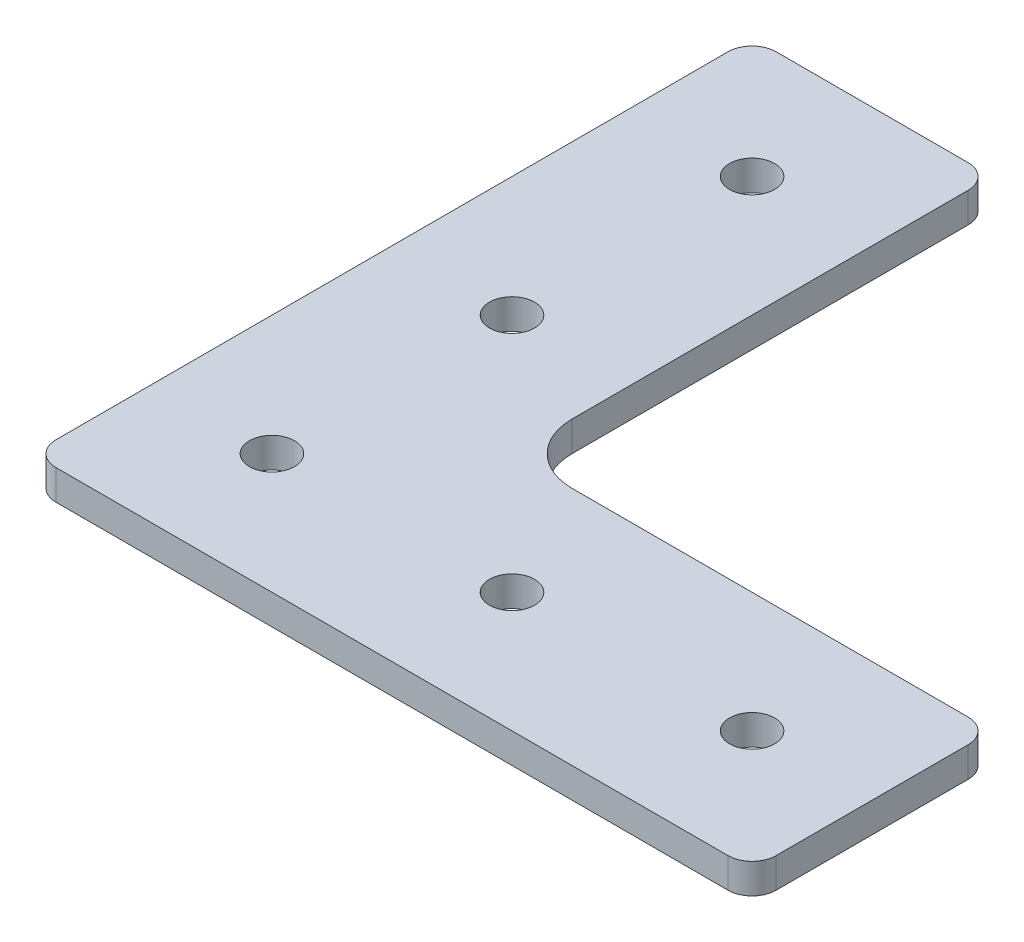
ISO-10303-21;
HEADER;
FILE_DESCRIPTION(('STEP AP214'),'2;1');
FILE_NAME('part.step','',(''),(''),'','','');
FILE_SCHEMA(('AUTOMOTIVE_DESIGN { 1 0 10303 214 1 1 1 1 }'));
ENDSEC;
DATA;
#1=APPLICATION_CONTEXT('core data for automotive mechanical design processes');
#2=APPLICATION_PROTOCOL_DEFINITION('international standard','automotive_design',2000,#1);
#3=PRODUCT_CONTEXT('',#1,'mechanical');
#4=PRODUCT('Part','Part','',(#3));
#5=PRODUCT_RELATED_PRODUCT_CATEGORY('part','',(#4));
#6=PRODUCT_DEFINITION_FORMATION('','',#4);
#7=PRODUCT_DEFINITION_CONTEXT('part definition',#1,'design');
#8=PRODUCT_DEFINITION('design','',#6,#7);
#9=PRODUCT_DEFINITION_SHAPE('','',#8);
#10=(LENGTH_UNIT() NAMED_UNIT(*) SI_UNIT(.MILLI.,.METRE.));
#11=(NAMED_UNIT(*) PLANE_ANGLE_UNIT() SI_UNIT($,.RADIAN.));
#12=(NAMED_UNIT(*) SI_UNIT($,.STERADIAN.) SOLID_ANGLE_UNIT());
#13=UNCERTAINTY_MEASURE_WITH_UNIT(LENGTH_MEASURE(1.E-05),#10,'distance_accuracy_value','');
#14=(GEOMETRIC_REPRESENTATION_CONTEXT(3) GLOBAL_UNCERTAINTY_ASSIGNED_CONTEXT((#13)) GLOBAL_UNIT_ASSIGNED_CONTEXT((#10,
#11,#12)) REPRESENTATION_CONTEXT('',''));
#15=CARTESIAN_POINT('',(0.,0.,0.));
#16=DIRECTION('',(0.,0.,1.));
#17=DIRECTION('',(1.,0.,0.));
#18=AXIS2_PLACEMENT_3D('',#15,#16,#17);
#19=CARTESIAN_POINT('',(60.96,3.175,35.56));
#20=DIRECTION('',(0.,1.,0.));
#21=DIRECTION('',(0.,0.,1.));
#22=AXIS2_PLACEMENT_3D('',#19,#20,#21);
#23=PLANE('',#22);
#24=CARTESIAN_POINT('',(25.4,3.175,25.4));
#25=DIRECTION('',(0.,1.,0.));
#26=DIRECTION('',(0.,0.,1.));
#27=AXIS2_PLACEMENT_3D('',#24,#25,#26);
#28=CIRCLE('',#27,2.38125);
#29=CARTESIAN_POINT('',(25.4,3.175,27.78125));
#30=VERTEX_POINT('',#29);
#31=EDGE_CURVE('E265',#30,#30,#28,.T.);
#32=ORIENTED_EDGE('',*,*,#31,.F.);
#33=EDGE_LOOP('',(#32));
#34=FACE_BOUND('',#33,.T.);
#35=CARTESIAN_POINT('',(0.,3.175,0.));
#36=DIRECTION('',(0.,1.,0.));
#37=DIRECTION('',(0.,0.,1.));
#38=AXIS2_PLACEMENT_3D('',#35,#36,#37);
#39=CIRCLE('',#38,2.38125);
#40=CARTESIAN_POINT('',(0.,3.175,2.38125));
#41=VERTEX_POINT('',#40);
#42=EDGE_CURVE('E253',#41,#41,#39,.T.);
#43=ORIENTED_EDGE('',*,*,#42,.F.);
#44=EDGE_LOOP('',(#43));
#45=FACE_BOUND('',#44,.T.);
#46=DIRECTION('',(1.,0.,0.));
#47=VECTOR('',#46,1.);
#48=CARTESIAN_POINT('',(6.34999999999999,3.175,38.1));
#49=LINE('',#48,#47);
#50=CARTESIAN_POINT('',(-10.16,3.175,38.1));
#51=VERTEX_POINT('',#50);
#52=CARTESIAN_POINT('',(60.96,3.175,38.1));
#53=VERTEX_POINT('',#52);
#54=EDGE_CURVE('E50',#51,#53,#49,.T.);
#55=ORIENTED_EDGE('',*,*,#54,.T.);
#56=CARTESIAN_POINT('',(60.96,3.175,35.56));
#57=DIRECTION('',(0.,1.,0.));
#58=DIRECTION('',(0.,0.,1.));
#59=AXIS2_PLACEMENT_3D('',#56,#57,#58);
#60=CIRCLE('',#59,2.54);
#61=CARTESIAN_POINT('',(63.5,3.175,35.56));
#62=VERTEX_POINT('',#61);
#63=EDGE_CURVE('E106',#53,#62,#60,.T.);
#64=ORIENTED_EDGE('',*,*,#63,.T.);
#65=DIRECTION('',(0.,0.,-1.));
#66=VECTOR('',#65,1.);
#67=CARTESIAN_POINT('',(63.5,3.175,35.56));
#68=LINE('',#67,#66);
#69=CARTESIAN_POINT('',(63.5,3.175,15.24));
#70=VERTEX_POINT('',#69);
#71=EDGE_CURVE('E206',#62,#70,#68,.T.);
#72=ORIENTED_EDGE('',*,*,#71,.T.);
#73=CARTESIAN_POINT('',(60.96,3.175,15.24));
#74=DIRECTION('',(0.,1.,0.));
#75=DIRECTION('',(0.,0.,1.));
#76=AXIS2_PLACEMENT_3D('',#73,#74,#75);
#77=CIRCLE('',#76,2.54);
#78=CARTESIAN_POINT('',(60.96,3.175,12.7));
#79=VERTEX_POINT('',#78);
#80=EDGE_CURVE('E226',#70,#79,#77,.T.);
#81=ORIENTED_EDGE('',*,*,#80,.T.);
#82=DIRECTION('',(-1.,0.,0.));
#83=VECTOR('',#82,1.);
#84=CARTESIAN_POINT('',(19.05,3.175,12.7));
#85=LINE('',#84,#83);
#86=CARTESIAN_POINT('',(19.05,3.175,12.7));
#87=VERTEX_POINT('',#86);
#88=EDGE_CURVE('E223',#79,#87,#85,.T.);
#89=ORIENTED_EDGE('',*,*,#88,.T.);
#90=CARTESIAN_POINT('',(19.05,3.175,6.35));
#91=DIRECTION('',(0.,-1.,0.));
#92=DIRECTION('',(0.,0.,-1.));
#93=AXIS2_PLACEMENT_3D('',#90,#91,#92);
#94=CIRCLE('',#93,6.35);
#95=CARTESIAN_POINT('',(12.7,3.175,6.35));
#96=VERTEX_POINT('',#95);
#97=EDGE_CURVE('E225',#87,#96,#94,.T.);
#98=ORIENTED_EDGE('',*,*,#97,.T.);
#99=DIRECTION('',(0.,0.,-1.));
#100=VECTOR('',#99,1.);
#101=CARTESIAN_POINT('',(12.7,3.175,6.35));
#102=LINE('',#101,#100);
#103=CARTESIAN_POINT('',(12.7,3.175,-35.56));
#104=VERTEX_POINT('',#103);
#105=EDGE_CURVE('E228',#96,#104,#102,.T.);
#106=ORIENTED_EDGE('',*,*,#105,.T.);
#107=CARTESIAN_POINT('',(10.16,3.175,-35.56));
#108=DIRECTION('',(0.,1.,0.));
#109=DIRECTION('',(0.,0.,1.));
#110=AXIS2_PLACEMENT_3D('',#107,#108,#109);
#111=CIRCLE('',#110,2.54);
#112=CARTESIAN_POINT('',(10.16,3.175,-38.1));
#113=VERTEX_POINT('',#112);
#114=EDGE_CURVE('E234',#104,#113,#111,.T.);
#115=ORIENTED_EDGE('',*,*,#114,.T.);
#116=DIRECTION('',(-1.,0.,0.));
#117=VECTOR('',#116,1.);
#118=CARTESIAN_POINT('',(-10.16,3.175,-38.1));
#119=LINE('',#118,#117);
#120=CARTESIAN_POINT('',(-10.16,3.175,-38.1));
#121=VERTEX_POINT('',#120);
#122=EDGE_CURVE('E138',#113,#121,#119,.T.);
#123=ORIENTED_EDGE('',*,*,#122,.T.);
#124=CARTESIAN_POINT('',(-10.16,3.175,-35.56));
#125=DIRECTION('',(0.,1.,0.));
#126=DIRECTION('',(0.,0.,-1.));
#127=AXIS2_PLACEMENT_3D('',#124,#125,#126);
#128=CIRCLE('',#127,2.54);
#129=CARTESIAN_POINT('',(-12.7,3.175,-35.56));
#130=VERTEX_POINT('',#129);
#131=EDGE_CURVE('E132',#121,#130,#128,.T.);
#132=ORIENTED_EDGE('',*,*,#131,.T.);
#133=DIRECTION('',(0.,0.,1.));
#134=VECTOR('',#133,1.);
#135=CARTESIAN_POINT('',(-12.7,3.175,35.56));
#136=LINE('',#135,#134);
#137=CARTESIAN_POINT('',(-12.7,3.175,35.56));
#138=VERTEX_POINT('',#137);
#139=EDGE_CURVE('E136',#130,#138,#136,.T.);
#140=ORIENTED_EDGE('',*,*,#139,.T.);
#141=CARTESIAN_POINT('',(-10.16,3.175,35.56));
#142=DIRECTION('',(0.,1.,0.));
#143=DIRECTION('',(0.,0.,1.));
#144=AXIS2_PLACEMENT_3D('',#141,#142,#143);
#145=CIRCLE('',#144,2.54);
#146=EDGE_CURVE('E152',#138,#51,#145,.T.);
#147=ORIENTED_EDGE('',*,*,#146,.T.);
#148=EDGE_LOOP('',(#55,#64,#72,#81,#89,#98,#106,#115,#123,#132,#140,#147));
#149=FACE_BOUND('',#148,.T.);
#150=CARTESIAN_POINT('',(0.,3.175,25.4));
#151=DIRECTION('',(0.,1.,0.));
#152=DIRECTION('',(0.,0.,1.));
#153=AXIS2_PLACEMENT_3D('',#150,#151,#152);
#154=CIRCLE('',#153,2.38125);
#155=CARTESIAN_POINT('',(0.,3.175,27.78125));
#156=VERTEX_POINT('',#155);
#157=EDGE_CURVE('E161',#156,#156,#154,.T.);
#158=ORIENTED_EDGE('',*,*,#157,.F.);
#159=EDGE_LOOP('',(#158));
#160=FACE_BOUND('',#159,.T.);
#161=CARTESIAN_POINT('',(0.,3.175,-25.4));
#162=DIRECTION('',(0.,1.,0.));
#163=DIRECTION('',(0.,0.,1.));
#164=AXIS2_PLACEMENT_3D('',#161,#162,#163);
#165=CIRCLE('',#164,2.38125);
#166=CARTESIAN_POINT('',(0.,3.175,-23.01875));
#167=VERTEX_POINT('',#166);
#168=EDGE_CURVE('E259',#167,#167,#165,.T.);
#169=ORIENTED_EDGE('',*,*,#168,.F.);
#170=EDGE_LOOP('',(#169));
#171=FACE_BOUND('',#170,.T.);
#172=CARTESIAN_POINT('',(50.8,3.175,25.4));
#173=DIRECTION('',(0.,1.,0.));
#174=DIRECTION('',(0.,0.,1.));
#175=AXIS2_PLACEMENT_3D('',#172,#173,#174);
#176=CIRCLE('',#175,2.38125);
#177=CARTESIAN_POINT('',(50.8,3.175,27.78125));
#178=VERTEX_POINT('',#177);
#179=EDGE_CURVE('E271',#178,#178,#176,.T.);
#180=ORIENTED_EDGE('',*,*,#179,.F.);
#181=EDGE_LOOP('',(#180));
#182=FACE_BOUND('',#181,.T.);
#183=ADVANCED_FACE('F33',(#34,#45,#149,#160,#171,#182),#23,.T.);
#184=CARTESIAN_POINT('',(60.96,0.,35.56));
#185=DIRECTION('',(0.,1.,0.));
#186=DIRECTION('',(0.,0.,1.));
#187=AXIS2_PLACEMENT_3D('',#184,#185,#186);
#188=PLANE('',#187);
#189=CARTESIAN_POINT('',(60.96,0.,35.56));
#190=DIRECTION('',(0.,1.,0.));
#191=DIRECTION('',(0.,0.,1.));
#192=AXIS2_PLACEMENT_3D('',#189,#190,#191);
#193=CIRCLE('',#192,2.54);
#194=CARTESIAN_POINT('',(60.96,0.,38.1));
#195=VERTEX_POINT('',#194);
#196=CARTESIAN_POINT('',(63.5,0.,35.56));
#197=VERTEX_POINT('',#196);
#198=EDGE_CURVE('E158',#195,#197,#193,.T.);
#199=ORIENTED_EDGE('',*,*,#198,.F.);
#200=DIRECTION('',(1.,0.,0.));
#201=VECTOR('',#200,1.);
#202=CARTESIAN_POINT('',(-10.16,0.,38.1));
#203=LINE('',#202,#201);
#204=CARTESIAN_POINT('',(-10.16,0.,38.1));
#205=VERTEX_POINT('',#204);
#206=EDGE_CURVE('E178',#205,#195,#203,.T.);
#207=ORIENTED_EDGE('',*,*,#206,.F.);
#208=CARTESIAN_POINT('',(-10.16,0.,35.56));
#209=DIRECTION('',(0.,1.,0.));
#210=DIRECTION('',(0.,0.,1.));
#211=AXIS2_PLACEMENT_3D('',#208,#209,#210);
#212=CIRCLE('',#211,2.54);
#213=CARTESIAN_POINT('',(-12.7,0.,35.56));
#214=VERTEX_POINT('',#213);
#215=EDGE_CURVE('E99',#214,#205,#212,.T.);
#216=ORIENTED_EDGE('',*,*,#215,.F.);
#217=DIRECTION('',(0.,0.,1.));
#218=VECTOR('',#217,1.);
#219=CARTESIAN_POINT('',(-12.7,0.,35.56));
#220=LINE('',#219,#218);
#221=CARTESIAN_POINT('',(-12.7,0.,-35.56));
#222=VERTEX_POINT('',#221);
#223=EDGE_CURVE('E92',#222,#214,#220,.T.);
#224=ORIENTED_EDGE('',*,*,#223,.F.);
#225=CARTESIAN_POINT('',(-10.16,0.,-35.56));
#226=DIRECTION('',(0.,1.,0.));
#227=DIRECTION('',(0.,0.,-1.));
#228=AXIS2_PLACEMENT_3D('',#225,#226,#227);
#229=CIRCLE('',#228,2.54);
#230=CARTESIAN_POINT('',(-10.16,0.,-38.1));
#231=VERTEX_POINT('',#230);
#232=EDGE_CURVE('E146',#231,#222,#229,.T.);
#233=ORIENTED_EDGE('',*,*,#232,.F.);
#234=DIRECTION('',(-1.,0.,0.));
#235=VECTOR('',#234,1.);
#236=CARTESIAN_POINT('',(-10.16,0.,-38.1));
#237=LINE('',#236,#235);
#238=CARTESIAN_POINT('',(10.16,0.,-38.1));
#239=VERTEX_POINT('',#238);
#240=EDGE_CURVE('E173',#239,#231,#237,.T.);
#241=ORIENTED_EDGE('',*,*,#240,.F.);
#242=CARTESIAN_POINT('',(10.16,0.,-35.56));
#243=DIRECTION('',(0.,1.,0.));
#244=DIRECTION('',(0.,0.,1.));
#245=AXIS2_PLACEMENT_3D('',#242,#243,#244);
#246=CIRCLE('',#245,2.54);
#247=CARTESIAN_POINT('',(12.7,0.,-35.56));
#248=VERTEX_POINT('',#247);
#249=EDGE_CURVE('E171',#248,#239,#246,.T.);
#250=ORIENTED_EDGE('',*,*,#249,.F.);
#251=DIRECTION('',(0.,0.,-1.));
#252=VECTOR('',#251,1.);
#253=CARTESIAN_POINT('',(12.7,0.,6.35));
#254=LINE('',#253,#252);
#255=CARTESIAN_POINT('',(12.7,0.,6.35));
#256=VERTEX_POINT('',#255);
#257=EDGE_CURVE('E169',#256,#248,#254,.T.);
#258=ORIENTED_EDGE('',*,*,#257,.F.);
#259=CARTESIAN_POINT('',(19.05,0.,6.35));
#260=DIRECTION('',(0.,-1.,0.));
#261=DIRECTION('',(0.,0.,-1.));
#262=AXIS2_PLACEMENT_3D('',#259,#260,#261);
#263=CIRCLE('',#262,6.35);
#264=CARTESIAN_POINT('',(19.05,0.,12.7));
#265=VERTEX_POINT('',#264);
#266=EDGE_CURVE('E167',#265,#256,#263,.T.);
#267=ORIENTED_EDGE('',*,*,#266,.F.);
#268=DIRECTION('',(-1.,0.,0.));
#269=VECTOR('',#268,1.);
#270=CARTESIAN_POINT('',(19.05,0.,12.7));
#271=LINE('',#270,#269);
#272=CARTESIAN_POINT('',(60.96,0.,12.7));
#273=VERTEX_POINT('',#272);
#274=EDGE_CURVE('E165',#273,#265,#271,.T.);
#275=ORIENTED_EDGE('',*,*,#274,.F.);
#276=CARTESIAN_POINT('',(60.96,0.,15.24));
#277=DIRECTION('',(0.,1.,0.));
#278=DIRECTION('',(0.,0.,1.));
#279=AXIS2_PLACEMENT_3D('',#276,#277,#278);
#280=CIRCLE('',#279,2.54);
#281=CARTESIAN_POINT('',(63.5,0.,15.24));
#282=VERTEX_POINT('',#281);
#283=EDGE_CURVE('E163',#282,#273,#280,.T.);
#284=ORIENTED_EDGE('',*,*,#283,.F.);
#285=DIRECTION('',(0.,0.,-1.));
#286=VECTOR('',#285,1.);
#287=CARTESIAN_POINT('',(63.5,0.,35.56));
#288=LINE('',#287,#286);
#289=EDGE_CURVE('E160',#197,#282,#288,.T.);
#290=ORIENTED_EDGE('',*,*,#289,.F.);
#291=EDGE_LOOP('',(#199,#207,#216,#224,#233,#241,#250,#258,#267,#275,#284,#290));
#292=FACE_BOUND('',#291,.T.);
#293=CARTESIAN_POINT('',(0.,0.,25.4));
#294=DIRECTION('',(0.,1.,0.));
#295=DIRECTION('',(0.,0.,1.));
#296=AXIS2_PLACEMENT_3D('',#293,#294,#295);
#297=CIRCLE('',#296,2.38125);
#298=CARTESIAN_POINT('',(0.,0.,27.78125));
#299=VERTEX_POINT('',#298);
#300=EDGE_CURVE('E250',#299,#299,#297,.T.);
#301=ORIENTED_EDGE('',*,*,#300,.T.);
#302=EDGE_LOOP('',(#301));
#303=FACE_BOUND('',#302,.T.);
#304=CARTESIAN_POINT('',(0.,0.,0.));
#305=DIRECTION('',(0.,1.,0.));
#306=DIRECTION('',(0.,0.,1.));
#307=AXIS2_PLACEMENT_3D('',#304,#305,#306);
#308=CIRCLE('',#307,2.38125);
#309=CARTESIAN_POINT('',(0.,0.,2.38125));
#310=VERTEX_POINT('',#309);
#311=EDGE_CURVE('E256',#310,#310,#308,.T.);
#312=ORIENTED_EDGE('',*,*,#311,.T.);
#313=EDGE_LOOP('',(#312));
#314=FACE_BOUND('',#313,.T.);
#315=CARTESIAN_POINT('',(0.,0.,-25.4));
#316=DIRECTION('',(0.,1.,0.));
#317=DIRECTION('',(0.,0.,1.));
#318=AXIS2_PLACEMENT_3D('',#315,#316,#317);
#319=CIRCLE('',#318,2.38125);
#320=CARTESIAN_POINT('',(0.,0.,-23.01875));
#321=VERTEX_POINT('',#320);
#322=EDGE_CURVE('E262',#321,#321,#319,.T.);
#323=ORIENTED_EDGE('',*,*,#322,.T.);
#324=EDGE_LOOP('',(#323));
#325=FACE_BOUND('',#324,.T.);
#326=CARTESIAN_POINT('',(25.4,0.,25.4));
#327=DIRECTION('',(0.,1.,0.));
#328=DIRECTION('',(0.,0.,1.));
#329=AXIS2_PLACEMENT_3D('',#326,#327,#328);
#330=CIRCLE('',#329,2.38125);
#331=CARTESIAN_POINT('',(25.4,0.,27.78125));
#332=VERTEX_POINT('',#331);
#333=EDGE_CURVE('E268',#332,#332,#330,.T.);
#334=ORIENTED_EDGE('',*,*,#333,.T.);
#335=EDGE_LOOP('',(#334));
#336=FACE_BOUND('',#335,.T.);
#337=CARTESIAN_POINT('',(50.8,0.,25.4));
#338=DIRECTION('',(0.,1.,0.));
#339=DIRECTION('',(0.,0.,1.));
#340=AXIS2_PLACEMENT_3D('',#337,#338,#339);
#341=CIRCLE('',#340,2.38125);
#342=CARTESIAN_POINT('',(50.8,0.,27.78125));
#343=VERTEX_POINT('',#342);
#344=EDGE_CURVE('E274',#343,#343,#341,.T.);
#345=ORIENTED_EDGE('',*,*,#344,.T.);
#346=EDGE_LOOP('',(#345));
#347=FACE_BOUND('',#346,.T.);
#348=ADVANCED_FACE('F210',(#292,#303,#314,#325,#336,#347),#188,.F.);
#349=CARTESIAN_POINT('',(60.96,3.175,35.56));
#350=DIRECTION('',(0.,-1.,0.));
#351=DIRECTION('',(0.,0.,-1.));
#352=AXIS2_PLACEMENT_3D('',#349,#350,#351);
#353=CYLINDRICAL_SURFACE('',#352,2.54);
#354=ORIENTED_EDGE('',*,*,#198,.T.);
#355=DIRECTION('',(0.,-1.,0.));
#356=VECTOR('',#355,1.);
#357=CARTESIAN_POINT('',(63.5,3.175,35.56));
#358=LINE('',#357,#356);
#359=EDGE_CURVE('E42',#62,#197,#358,.T.);
#360=ORIENTED_EDGE('',*,*,#359,.F.);
#361=ORIENTED_EDGE('',*,*,#63,.F.);
#362=DIRECTION('',(0.,-1.,0.));
#363=VECTOR('',#362,1.);
#364=CARTESIAN_POINT('',(60.96,3.175,38.1));
#365=LINE('',#364,#363);
#366=EDGE_CURVE('E11',#53,#195,#365,.T.);
#367=ORIENTED_EDGE('',*,*,#366,.T.);
#368=EDGE_LOOP('',(#354,#360,#361,#367));
#369=FACE_BOUND('',#368,.T.);
#370=ADVANCED_FACE('F35',(#369),#353,.T.);
#371=CARTESIAN_POINT('',(63.5,3.175,35.56));
#372=DIRECTION('',(-1.,0.,0.));
#373=DIRECTION('',(0.,0.,1.));
#374=AXIS2_PLACEMENT_3D('',#371,#372,#373);
#375=PLANE('',#374);
#376=ORIENTED_EDGE('',*,*,#289,.T.);
#377=DIRECTION('',(0.,-1.,0.));
#378=VECTOR('',#377,1.);
#379=CARTESIAN_POINT('',(63.5,3.175,15.24));
#380=LINE('',#379,#378);
#381=EDGE_CURVE('E198',#70,#282,#380,.T.);
#382=ORIENTED_EDGE('',*,*,#381,.F.);
#383=ORIENTED_EDGE('',*,*,#71,.F.);
#384=ORIENTED_EDGE('',*,*,#359,.T.);
#385=EDGE_LOOP('',(#376,#382,#383,#384));
#386=FACE_BOUND('',#385,.T.);
#387=ADVANCED_FACE('F204',(#386),#375,.F.);
#388=CARTESIAN_POINT('',(60.96,3.175,15.24));
#389=DIRECTION('',(0.,-1.,0.));
#390=DIRECTION('',(0.,0.,-1.));
#391=AXIS2_PLACEMENT_3D('',#388,#389,#390);
#392=CYLINDRICAL_SURFACE('',#391,2.54);
#393=ORIENTED_EDGE('',*,*,#283,.T.);
#394=DIRECTION('',(0.,-1.,0.));
#395=VECTOR('',#394,1.);
#396=CARTESIAN_POINT('',(60.96,3.175,12.7));
#397=LINE('',#396,#395);
#398=EDGE_CURVE('E195',#79,#273,#397,.T.);
#399=ORIENTED_EDGE('',*,*,#398,.F.);
#400=ORIENTED_EDGE('',*,*,#80,.F.);
#401=ORIENTED_EDGE('',*,*,#381,.T.);
#402=EDGE_LOOP('',(#393,#399,#400,#401));
#403=FACE_BOUND('',#402,.T.);
#404=ADVANCED_FACE('F217',(#403),#392,.T.);
#405=CARTESIAN_POINT('',(19.05,3.175,12.7));
#406=DIRECTION('',(0.,0.,1.));
#407=DIRECTION('',(1.,0.,0.));
#408=AXIS2_PLACEMENT_3D('',#405,#406,#407);
#409=PLANE('',#408);
#410=ORIENTED_EDGE('',*,*,#274,.T.);
#411=DIRECTION('',(0.,-1.,0.));
#412=VECTOR('',#411,1.);
#413=CARTESIAN_POINT('',(19.05,3.175,12.7));
#414=LINE('',#413,#412);
#415=EDGE_CURVE('E192',#87,#265,#414,.T.);
#416=ORIENTED_EDGE('',*,*,#415,.F.);
#417=ORIENTED_EDGE('',*,*,#88,.F.);
#418=ORIENTED_EDGE('',*,*,#398,.T.);
#419=EDGE_LOOP('',(#410,#416,#417,#418));
#420=FACE_BOUND('',#419,.T.);
#421=ADVANCED_FACE('F221',(#420),#409,.F.);
#422=CARTESIAN_POINT('',(19.05,3.175,6.35));
#423=DIRECTION('',(0.,-1.,0.));
#424=DIRECTION('',(0.,0.,-1.));
#425=AXIS2_PLACEMENT_3D('',#422,#423,#424);
#426=CYLINDRICAL_SURFACE('',#425,6.35);
#427=ORIENTED_EDGE('',*,*,#266,.T.);
#428=DIRECTION('',(0.,-1.,0.));
#429=VECTOR('',#428,1.);
#430=CARTESIAN_POINT('',(12.7,3.175,6.35));
#431=LINE('',#430,#429);
#432=EDGE_CURVE('E189',#96,#256,#431,.T.);
#433=ORIENTED_EDGE('',*,*,#432,.F.);
#434=ORIENTED_EDGE('',*,*,#97,.F.);
#435=ORIENTED_EDGE('',*,*,#415,.T.);
#436=EDGE_LOOP('',(#427,#433,#434,#435));
#437=FACE_BOUND('',#436,.T.);
#438=ADVANCED_FACE('F311',(#437),#426,.F.);
#439=CARTESIAN_POINT('',(12.7,3.175,6.35));
#440=DIRECTION('',(-1.,0.,0.));
#441=DIRECTION('',(0.,0.,1.));
#442=AXIS2_PLACEMENT_3D('',#439,#440,#441);
#443=PLANE('',#442);
#444=ORIENTED_EDGE('',*,*,#257,.T.);
#445=DIRECTION('',(0.,-1.,0.));
#446=VECTOR('',#445,1.);
#447=CARTESIAN_POINT('',(12.7,3.175,-35.56));
#448=LINE('',#447,#446);
#449=EDGE_CURVE('E186',#104,#248,#448,.T.);
#450=ORIENTED_EDGE('',*,*,#449,.F.);
#451=ORIENTED_EDGE('',*,*,#105,.F.);
#452=ORIENTED_EDGE('',*,*,#432,.T.);
#453=EDGE_LOOP('',(#444,#450,#451,#452));
#454=FACE_BOUND('',#453,.T.);
#455=ADVANCED_FACE('F308',(#454),#443,.F.);
#456=CARTESIAN_POINT('',(10.16,3.175,-35.56));
#457=DIRECTION('',(0.,-1.,0.));
#458=DIRECTION('',(0.,0.,-1.));
#459=AXIS2_PLACEMENT_3D('',#456,#457,#458);
#460=CYLINDRICAL_SURFACE('',#459,2.54);
#461=ORIENTED_EDGE('',*,*,#249,.T.);
#462=DIRECTION('',(0.,-1.,0.));
#463=VECTOR('',#462,1.);
#464=CARTESIAN_POINT('',(10.16,3.175,-38.1));
#465=LINE('',#464,#463);
#466=EDGE_CURVE('E183',#113,#239,#465,.T.);
#467=ORIENTED_EDGE('',*,*,#466,.F.);
#468=ORIENTED_EDGE('',*,*,#114,.F.);
#469=ORIENTED_EDGE('',*,*,#449,.T.);
#470=EDGE_LOOP('',(#461,#467,#468,#469));
#471=FACE_BOUND('',#470,.T.);
#472=ADVANCED_FACE('F240',(#471),#460,.T.);
#473=CARTESIAN_POINT('',(-10.16,3.175,-38.1));
#474=DIRECTION('',(0.,0.,1.));
#475=DIRECTION('',(1.,0.,0.));
#476=AXIS2_PLACEMENT_3D('',#473,#474,#475);
#477=PLANE('',#476);
#478=ORIENTED_EDGE('',*,*,#240,.T.);
#479=DIRECTION('',(0.,-1.,0.));
#480=VECTOR('',#479,1.);
#481=CARTESIAN_POINT('',(-10.16,3.175,-38.1));
#482=LINE('',#481,#480);
#483=EDGE_CURVE('E147',#121,#231,#482,.T.);
#484=ORIENTED_EDGE('',*,*,#483,.F.);
#485=ORIENTED_EDGE('',*,*,#122,.F.);
#486=ORIENTED_EDGE('',*,*,#466,.T.);
#487=EDGE_LOOP('',(#478,#484,#485,#486));
#488=FACE_BOUND('',#487,.T.);
#489=ADVANCED_FACE('F244',(#488),#477,.F.);
#490=CARTESIAN_POINT('',(-10.16,3.175,-35.56));
#491=DIRECTION('',(0.,-1.,0.));
#492=DIRECTION('',(0.,0.,-1.));
#493=AXIS2_PLACEMENT_3D('',#490,#491,#492);
#494=CYLINDRICAL_SURFACE('',#493,2.54);
#495=ORIENTED_EDGE('',*,*,#232,.T.);
#496=DIRECTION('',(0.,-1.,0.));
#497=VECTOR('',#496,1.);
#498=CARTESIAN_POINT('',(-12.7,3.175,-35.56));
#499=LINE('',#498,#497);
#500=EDGE_CURVE('E143',#130,#222,#499,.T.);
#501=ORIENTED_EDGE('',*,*,#500,.F.);
#502=ORIENTED_EDGE('',*,*,#131,.F.);
#503=ORIENTED_EDGE('',*,*,#483,.T.);
#504=EDGE_LOOP('',(#495,#501,#502,#503));
#505=FACE_BOUND('',#504,.T.);
#506=ADVANCED_FACE('F144',(#505),#494,.T.);
#507=CARTESIAN_POINT('',(-12.7,3.175,35.56));
#508=DIRECTION('',(1.,0.,0.));
#509=DIRECTION('',(0.,0.,-1.));
#510=AXIS2_PLACEMENT_3D('',#507,#508,#509);
#511=PLANE('',#510);
#512=ORIENTED_EDGE('',*,*,#223,.T.);
#513=DIRECTION('',(0.,-1.,0.));
#514=VECTOR('',#513,1.);
#515=CARTESIAN_POINT('',(-12.7,3.175,35.56));
#516=LINE('',#515,#514);
#517=EDGE_CURVE('E148',#138,#214,#516,.T.);
#518=ORIENTED_EDGE('',*,*,#517,.F.);
#519=ORIENTED_EDGE('',*,*,#139,.F.);
#520=ORIENTED_EDGE('',*,*,#500,.T.);
#521=EDGE_LOOP('',(#512,#518,#519,#520));
#522=FACE_BOUND('',#521,.T.);
#523=ADVANCED_FACE('F150',(#522),#511,.F.);
#524=CARTESIAN_POINT('',(-10.16,3.175,35.56));
#525=DIRECTION('',(0.,-1.,0.));
#526=DIRECTION('',(0.,0.,-1.));
#527=AXIS2_PLACEMENT_3D('',#524,#525,#526);
#528=CYLINDRICAL_SURFACE('',#527,2.54);
#529=ORIENTED_EDGE('',*,*,#215,.T.);
#530=DIRECTION('',(0.,-1.,0.));
#531=VECTOR('',#530,1.);
#532=CARTESIAN_POINT('',(-10.16,3.175,38.1));
#533=LINE('',#532,#531);
#534=EDGE_CURVE('E154',#51,#205,#533,.T.);
#535=ORIENTED_EDGE('',*,*,#534,.F.);
#536=ORIENTED_EDGE('',*,*,#146,.F.);
#537=ORIENTED_EDGE('',*,*,#517,.T.);
#538=EDGE_LOOP('',(#529,#535,#536,#537));
#539=FACE_BOUND('',#538,.T.);
#540=ADVANCED_FACE('F246',(#539),#528,.T.);
#541=CARTESIAN_POINT('',(-10.16,3.175,38.1));
#542=DIRECTION('',(0.,0.,-1.));
#543=DIRECTION('',(-1.,0.,0.));
#544=AXIS2_PLACEMENT_3D('',#541,#542,#543);
#545=PLANE('',#544);
#546=ORIENTED_EDGE('',*,*,#206,.T.);
#547=ORIENTED_EDGE('',*,*,#366,.F.);
#548=ORIENTED_EDGE('',*,*,#54,.F.);
#549=ORIENTED_EDGE('',*,*,#534,.T.);
#550=EDGE_LOOP('',(#546,#547,#548,#549));
#551=FACE_BOUND('',#550,.T.);
#552=ADVANCED_FACE('F245',(#551),#545,.F.);
#553=CARTESIAN_POINT('',(0.,3.175,25.4));
#554=DIRECTION('',(0.,-1.,0.));
#555=DIRECTION('',(0.,0.,-1.));
#556=AXIS2_PLACEMENT_3D('',#553,#554,#555);
#557=CYLINDRICAL_SURFACE('',#556,2.38125);
#558=ORIENTED_EDGE('',*,*,#157,.T.);
#559=EDGE_LOOP('',(#558));
#560=FACE_BOUND('',#559,.T.);
#561=ORIENTED_EDGE('',*,*,#300,.F.);
#562=EDGE_LOOP('',(#561));
#563=FACE_BOUND('',#562,.T.);
#564=ADVANCED_FACE('F293',(#560,#563),#557,.F.);
#565=CARTESIAN_POINT('',(0.,3.175,0.));
#566=DIRECTION('',(0.,-1.,0.));
#567=DIRECTION('',(0.,0.,-1.));
#568=AXIS2_PLACEMENT_3D('',#565,#566,#567);
#569=CYLINDRICAL_SURFACE('',#568,2.38125);
#570=ORIENTED_EDGE('',*,*,#42,.T.);
#571=EDGE_LOOP('',(#570));
#572=FACE_BOUND('',#571,.T.);
#573=ORIENTED_EDGE('',*,*,#311,.F.);
#574=EDGE_LOOP('',(#573));
#575=FACE_BOUND('',#574,.T.);
#576=ADVANCED_FACE('F402',(#572,#575),#569,.F.);
#577=CARTESIAN_POINT('',(0.,3.175,-25.4));
#578=DIRECTION('',(0.,-1.,0.));
#579=DIRECTION('',(0.,0.,-1.));
#580=AXIS2_PLACEMENT_3D('',#577,#578,#579);
#581=CYLINDRICAL_SURFACE('',#580,2.38125);
#582=ORIENTED_EDGE('',*,*,#168,.T.);
#583=EDGE_LOOP('',(#582));
#584=FACE_BOUND('',#583,.T.);
#585=ORIENTED_EDGE('',*,*,#322,.F.);
#586=EDGE_LOOP('',(#585));
#587=FACE_BOUND('',#586,.T.);
#588=ADVANCED_FACE('F410',(#584,#587),#581,.F.);
#589=CARTESIAN_POINT('',(25.4,3.175,25.4));
#590=DIRECTION('',(0.,-1.,0.));
#591=DIRECTION('',(0.,0.,-1.));
#592=AXIS2_PLACEMENT_3D('',#589,#590,#591);
#593=CYLINDRICAL_SURFACE('',#592,2.38125);
#594=ORIENTED_EDGE('',*,*,#31,.T.);
#595=EDGE_LOOP('',(#594));
#596=FACE_BOUND('',#595,.T.);
#597=ORIENTED_EDGE('',*,*,#333,.F.);
#598=EDGE_LOOP('',(#597));
#599=FACE_BOUND('',#598,.T.);
#600=ADVANCED_FACE('F418',(#596,#599),#593,.F.);
#601=CARTESIAN_POINT('',(50.8,3.175,25.4));
#602=DIRECTION('',(0.,-1.,0.));
#603=DIRECTION('',(0.,0.,-1.));
#604=AXIS2_PLACEMENT_3D('',#601,#602,#603);
#605=CYLINDRICAL_SURFACE('',#604,2.38125);
#606=ORIENTED_EDGE('',*,*,#179,.T.);
#607=EDGE_LOOP('',(#606));
#608=FACE_BOUND('',#607,.T.);
#609=ORIENTED_EDGE('',*,*,#344,.F.);
#610=EDGE_LOOP('',(#609));
#611=FACE_BOUND('',#610,.T.);
#612=ADVANCED_FACE('F280',(#608,#611),#605,.F.);
#613=CLOSED_SHELL('',(#183,#348,#370,#387,#404,#421,#438,#455,#472,#489,#506,#523,#540,#552,
#564,#576,#588,#600,#612));
#614=MANIFOLD_SOLID_BREP('B2',#613);
#615=ADVANCED_BREP_SHAPE_REPRESENTATION('',(#18,#614),#14);
#616=SHAPE_DEFINITION_REPRESENTATION(#9,#615);
ENDSEC;
END-ISO-10303-21;
